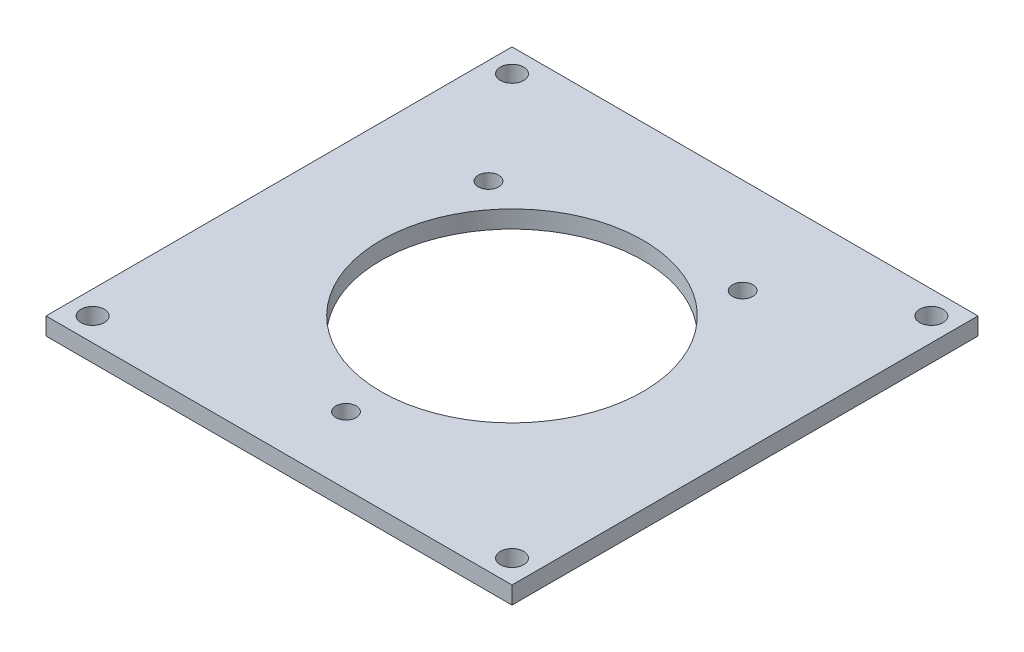
ISO-10303-21;
HEADER;
FILE_DESCRIPTION(('STEP AP214'),'2;1');
FILE_NAME('part.step','',(''),(''),'','','');
FILE_SCHEMA(('AUTOMOTIVE_DESIGN { 1 0 10303 214 1 1 1 1 }'));
ENDSEC;
DATA;
#1=APPLICATION_CONTEXT('core data for automotive mechanical design processes');
#2=APPLICATION_PROTOCOL_DEFINITION('international standard','automotive_design',2000,#1);
#3=PRODUCT_CONTEXT('',#1,'mechanical');
#4=PRODUCT('Part','Part','',(#3));
#5=PRODUCT_RELATED_PRODUCT_CATEGORY('part','',(#4));
#6=PRODUCT_DEFINITION_FORMATION('','',#4);
#7=PRODUCT_DEFINITION_CONTEXT('part definition',#1,'design');
#8=PRODUCT_DEFINITION('design','',#6,#7);
#9=PRODUCT_DEFINITION_SHAPE('','',#8);
#10=(LENGTH_UNIT() NAMED_UNIT(*) SI_UNIT(.MILLI.,.METRE.));
#11=(NAMED_UNIT(*) PLANE_ANGLE_UNIT() SI_UNIT($,.RADIAN.));
#12=(NAMED_UNIT(*) SI_UNIT($,.STERADIAN.) SOLID_ANGLE_UNIT());
#13=UNCERTAINTY_MEASURE_WITH_UNIT(LENGTH_MEASURE(1.E-05),#10,'distance_accuracy_value','');
#14=(GEOMETRIC_REPRESENTATION_CONTEXT(3) GLOBAL_UNCERTAINTY_ASSIGNED_CONTEXT((#13)) GLOBAL_UNIT_ASSIGNED_CONTEXT((#10,
#11,#12)) REPRESENTATION_CONTEXT('',''));
#15=CARTESIAN_POINT('',(0.,0.,0.));
#16=DIRECTION('',(0.,0.,1.));
#17=DIRECTION('',(1.,0.,0.));
#18=AXIS2_PLACEMENT_3D('',#15,#16,#17);
#19=CARTESIAN_POINT('',(-40.,3.,40.));
#20=DIRECTION('',(0.,1.,0.));
#21=DIRECTION('',(0.,0.,1.));
#22=AXIS2_PLACEMENT_3D('',#19,#20,#21);
#23=PLANE('',#22);
#24=CARTESIAN_POINT('',(36.,3.,36.));
#25=DIRECTION('',(0.,1.,0.));
#26=DIRECTION('',(0.,0.,1.));
#27=AXIS2_PLACEMENT_3D('',#24,#25,#26);
#28=CIRCLE('',#27,2.);
#29=CARTESIAN_POINT('',(36.,3.,38.));
#30=VERTEX_POINT('',#29);
#31=EDGE_CURVE('E144',#30,#30,#28,.T.);
#32=ORIENTED_EDGE('',*,*,#31,.F.);
#33=EDGE_LOOP('',(#32));
#34=FACE_BOUND('',#33,.T.);
#35=CARTESIAN_POINT('',(36.,3.,-36.));
#36=DIRECTION('',(0.,1.,0.));
#37=DIRECTION('',(0.,0.,-1.));
#38=AXIS2_PLACEMENT_3D('',#35,#36,#37);
#39=CIRCLE('',#38,2.);
#40=CARTESIAN_POINT('',(36.,3.,-38.));
#41=VERTEX_POINT('',#40);
#42=EDGE_CURVE('E132',#41,#41,#39,.T.);
#43=ORIENTED_EDGE('',*,*,#42,.F.);
#44=EDGE_LOOP('',(#43));
#45=FACE_BOUND('',#44,.T.);
#46=CARTESIAN_POINT('',(0.,3.,28.5));
#47=DIRECTION('',(0.,1.,0.));
#48=DIRECTION('',(0.,0.,1.));
#49=AXIS2_PLACEMENT_3D('',#46,#47,#48);
#50=CIRCLE('',#49,1.75);
#51=CARTESIAN_POINT('',(0.,3.,30.25));
#52=VERTEX_POINT('',#51);
#53=EDGE_CURVE('E120',#52,#52,#50,.T.);
#54=ORIENTED_EDGE('',*,*,#53,.F.);
#55=EDGE_LOOP('',(#54));
#56=FACE_BOUND('',#55,.T.);
#57=CARTESIAN_POINT('',(-36.,3.,-36.));
#58=DIRECTION('',(0.,1.,0.));
#59=DIRECTION('',(0.,0.,1.));
#60=AXIS2_PLACEMENT_3D('',#57,#58,#59);
#61=CIRCLE('',#60,2.);
#62=CARTESIAN_POINT('',(-36.,3.,-34.));
#63=VERTEX_POINT('',#62);
#64=EDGE_CURVE('E99',#63,#63,#61,.T.);
#65=ORIENTED_EDGE('',*,*,#64,.F.);
#66=EDGE_LOOP('',(#65));
#67=FACE_BOUND('',#66,.T.);
#68=DIRECTION('',(0.,0.,1.));
#69=VECTOR('',#68,1.);
#70=CARTESIAN_POINT('',(-40.,3.,-40.));
#71=LINE('',#70,#69);
#72=CARTESIAN_POINT('',(-40.,3.,-40.));
#73=VERTEX_POINT('',#72);
#74=CARTESIAN_POINT('',(-40.,3.,40.));
#75=VERTEX_POINT('',#74);
#76=EDGE_CURVE('E84',#73,#75,#71,.T.);
#77=ORIENTED_EDGE('',*,*,#76,.T.);
#78=DIRECTION('',(1.,0.,0.));
#79=VECTOR('',#78,1.);
#80=CARTESIAN_POINT('',(-40.,3.,40.));
#81=LINE('',#80,#79);
#82=CARTESIAN_POINT('',(40.,3.,40.));
#83=VERTEX_POINT('',#82);
#84=EDGE_CURVE('E79',#75,#83,#81,.T.);
#85=ORIENTED_EDGE('',*,*,#84,.T.);
#86=DIRECTION('',(0.,0.,-1.));
#87=VECTOR('',#86,1.);
#88=CARTESIAN_POINT('',(40.,3.,-40.));
#89=LINE('',#88,#87);
#90=CARTESIAN_POINT('',(40.,3.,-40.));
#91=VERTEX_POINT('',#90);
#92=EDGE_CURVE('E82',#83,#91,#89,.T.);
#93=ORIENTED_EDGE('',*,*,#92,.T.);
#94=DIRECTION('',(-1.,0.,0.));
#95=VECTOR('',#94,1.);
#96=CARTESIAN_POINT('',(-40.,3.,-40.));
#97=LINE('',#96,#95);
#98=EDGE_CURVE('E49',#91,#73,#97,.T.);
#99=ORIENTED_EDGE('',*,*,#98,.T.);
#100=EDGE_LOOP('',(#77,#85,#93,#99));
#101=FACE_BOUND('',#100,.T.);
#102=CARTESIAN_POINT('',(-22.0713342198514,3.,-18.030701754386));
#103=DIRECTION('',(0.,1.,0.));
#104=DIRECTION('',(0.,0.,1.));
#105=AXIS2_PLACEMENT_3D('',#102,#103,#104);
#106=CIRCLE('',#105,1.75);
#107=CARTESIAN_POINT('',(-22.0713342198514,3.,-16.280701754386));
#108=VERTEX_POINT('',#107);
#109=EDGE_CURVE('E114',#108,#108,#106,.T.);
#110=ORIENTED_EDGE('',*,*,#109,.F.);
#111=EDGE_LOOP('',(#110));
#112=FACE_BOUND('',#111,.T.);
#113=CARTESIAN_POINT('',(16.0287564116208,3.,-23.5654188992457));
#114=DIRECTION('',(0.,1.,0.));
#115=DIRECTION('',(0.,0.,1.));
#116=AXIS2_PLACEMENT_3D('',#113,#114,#115);
#117=CIRCLE('',#116,1.75);
#118=CARTESIAN_POINT('',(16.0287564116208,3.,-21.8154188992457));
#119=VERTEX_POINT('',#118);
#120=EDGE_CURVE('E126',#119,#119,#117,.T.);
#121=ORIENTED_EDGE('',*,*,#120,.F.);
#122=EDGE_LOOP('',(#121));
#123=FACE_BOUND('',#122,.T.);
#124=CARTESIAN_POINT('',(-36.,3.,36.));
#125=DIRECTION('',(0.,1.,0.));
#126=DIRECTION('',(0.,0.,-1.));
#127=AXIS2_PLACEMENT_3D('',#124,#125,#126);
#128=CIRCLE('',#127,2.);
#129=CARTESIAN_POINT('',(-36.,3.,34.));
#130=VERTEX_POINT('',#129);
#131=EDGE_CURVE('E138',#130,#130,#128,.T.);
#132=ORIENTED_EDGE('',*,*,#131,.F.);
#133=EDGE_LOOP('',(#132));
#134=FACE_BOUND('',#133,.T.);
#135=CARTESIAN_POINT('',(0.,3.,0.));
#136=DIRECTION('',(0.,1.,0.));
#137=DIRECTION('',(0.,0.,1.));
#138=AXIS2_PLACEMENT_3D('',#135,#136,#137);
#139=CIRCLE('',#138,22.5);
#140=CARTESIAN_POINT('',(0.,3.,22.5));
#141=VERTEX_POINT('',#140);
#142=EDGE_CURVE('E150',#141,#141,#139,.T.);
#143=ORIENTED_EDGE('',*,*,#142,.F.);
#144=EDGE_LOOP('',(#143));
#145=FACE_BOUND('',#144,.T.);
#146=ADVANCED_FACE('F32',(#34,#45,#56,#67,#101,#112,#123,#134,#145),#23,.T.);
#147=CARTESIAN_POINT('',(-40.,0.,40.));
#148=DIRECTION('',(0.,1.,0.));
#149=DIRECTION('',(0.,0.,1.));
#150=AXIS2_PLACEMENT_3D('',#147,#148,#149);
#151=PLANE('',#150);
#152=CARTESIAN_POINT('',(36.,0.,36.));
#153=DIRECTION('',(0.,1.,0.));
#154=DIRECTION('',(0.,0.,1.));
#155=AXIS2_PLACEMENT_3D('',#152,#153,#154);
#156=CIRCLE('',#155,2.);
#157=CARTESIAN_POINT('',(36.,0.,38.));
#158=VERTEX_POINT('',#157);
#159=EDGE_CURVE('E147',#158,#158,#156,.T.);
#160=ORIENTED_EDGE('',*,*,#159,.T.);
#161=EDGE_LOOP('',(#160));
#162=FACE_BOUND('',#161,.T.);
#163=CARTESIAN_POINT('',(36.,0.,-36.));
#164=DIRECTION('',(0.,1.,0.));
#165=DIRECTION('',(0.,0.,-1.));
#166=AXIS2_PLACEMENT_3D('',#163,#164,#165);
#167=CIRCLE('',#166,2.);
#168=CARTESIAN_POINT('',(36.,0.,-38.));
#169=VERTEX_POINT('',#168);
#170=EDGE_CURVE('E135',#169,#169,#167,.T.);
#171=ORIENTED_EDGE('',*,*,#170,.T.);
#172=EDGE_LOOP('',(#171));
#173=FACE_BOUND('',#172,.T.);
#174=CARTESIAN_POINT('',(0.,0.,28.5));
#175=DIRECTION('',(0.,1.,0.));
#176=DIRECTION('',(0.,0.,1.));
#177=AXIS2_PLACEMENT_3D('',#174,#175,#176);
#178=CIRCLE('',#177,1.75);
#179=CARTESIAN_POINT('',(0.,0.,30.25));
#180=VERTEX_POINT('',#179);
#181=EDGE_CURVE('E123',#180,#180,#178,.T.);
#182=ORIENTED_EDGE('',*,*,#181,.T.);
#183=EDGE_LOOP('',(#182));
#184=FACE_BOUND('',#183,.T.);
#185=CARTESIAN_POINT('',(-36.,0.,-36.));
#186=DIRECTION('',(0.,1.,0.));
#187=DIRECTION('',(0.,0.,1.));
#188=AXIS2_PLACEMENT_3D('',#185,#186,#187);
#189=CIRCLE('',#188,2.);
#190=CARTESIAN_POINT('',(-36.,0.,-34.));
#191=VERTEX_POINT('',#190);
#192=EDGE_CURVE('E111',#191,#191,#189,.T.);
#193=ORIENTED_EDGE('',*,*,#192,.T.);
#194=EDGE_LOOP('',(#193));
#195=FACE_BOUND('',#194,.T.);
#196=DIRECTION('',(0.,0.,1.));
#197=VECTOR('',#196,1.);
#198=CARTESIAN_POINT('',(-40.,0.,-40.));
#199=LINE('',#198,#197);
#200=CARTESIAN_POINT('',(-40.,0.,-40.));
#201=VERTEX_POINT('',#200);
#202=CARTESIAN_POINT('',(-40.,0.,40.));
#203=VERTEX_POINT('',#202);
#204=EDGE_CURVE('E96',#201,#203,#199,.T.);
#205=ORIENTED_EDGE('',*,*,#204,.F.);
#206=DIRECTION('',(-1.,0.,0.));
#207=VECTOR('',#206,1.);
#208=CARTESIAN_POINT('',(-40.,0.,-40.));
#209=LINE('',#208,#207);
#210=CARTESIAN_POINT('',(40.,0.,-40.));
#211=VERTEX_POINT('',#210);
#212=EDGE_CURVE('E72',#211,#201,#209,.T.);
#213=ORIENTED_EDGE('',*,*,#212,.F.);
#214=DIRECTION('',(0.,0.,-1.));
#215=VECTOR('',#214,1.);
#216=CARTESIAN_POINT('',(40.,0.,-40.));
#217=LINE('',#216,#215);
#218=CARTESIAN_POINT('',(40.,0.,40.));
#219=VERTEX_POINT('',#218);
#220=EDGE_CURVE('E66',#219,#211,#217,.T.);
#221=ORIENTED_EDGE('',*,*,#220,.F.);
#222=DIRECTION('',(1.,0.,0.));
#223=VECTOR('',#222,1.);
#224=CARTESIAN_POINT('',(-40.,0.,40.));
#225=LINE('',#224,#223);
#226=EDGE_CURVE('E88',#203,#219,#225,.T.);
#227=ORIENTED_EDGE('',*,*,#226,.F.);
#228=EDGE_LOOP('',(#205,#213,#221,#227));
#229=FACE_BOUND('',#228,.T.);
#230=CARTESIAN_POINT('',(-22.0713342198514,0.,-18.030701754386));
#231=DIRECTION('',(0.,1.,0.));
#232=DIRECTION('',(0.,0.,1.));
#233=AXIS2_PLACEMENT_3D('',#230,#231,#232);
#234=CIRCLE('',#233,1.75);
#235=CARTESIAN_POINT('',(-22.0713342198514,0.,-16.280701754386));
#236=VERTEX_POINT('',#235);
#237=EDGE_CURVE('E117',#236,#236,#234,.T.);
#238=ORIENTED_EDGE('',*,*,#237,.T.);
#239=EDGE_LOOP('',(#238));
#240=FACE_BOUND('',#239,.T.);
#241=CARTESIAN_POINT('',(16.0287564116208,0.,-23.5654188992457));
#242=DIRECTION('',(0.,1.,0.));
#243=DIRECTION('',(0.,0.,1.));
#244=AXIS2_PLACEMENT_3D('',#241,#242,#243);
#245=CIRCLE('',#244,1.75);
#246=CARTESIAN_POINT('',(16.0287564116208,0.,-21.8154188992457));
#247=VERTEX_POINT('',#246);
#248=EDGE_CURVE('E129',#247,#247,#245,.T.);
#249=ORIENTED_EDGE('',*,*,#248,.T.);
#250=EDGE_LOOP('',(#249));
#251=FACE_BOUND('',#250,.T.);
#252=CARTESIAN_POINT('',(-36.,0.,36.));
#253=DIRECTION('',(0.,1.,0.));
#254=DIRECTION('',(0.,0.,-1.));
#255=AXIS2_PLACEMENT_3D('',#252,#253,#254);
#256=CIRCLE('',#255,2.);
#257=CARTESIAN_POINT('',(-36.,0.,34.));
#258=VERTEX_POINT('',#257);
#259=EDGE_CURVE('E141',#258,#258,#256,.T.);
#260=ORIENTED_EDGE('',*,*,#259,.T.);
#261=EDGE_LOOP('',(#260));
#262=FACE_BOUND('',#261,.T.);
#263=CARTESIAN_POINT('',(0.,0.,0.));
#264=DIRECTION('',(0.,1.,0.));
#265=DIRECTION('',(0.,0.,1.));
#266=AXIS2_PLACEMENT_3D('',#263,#264,#265);
#267=CIRCLE('',#266,22.5);
#268=CARTESIAN_POINT('',(0.,0.,22.5));
#269=VERTEX_POINT('',#268);
#270=EDGE_CURVE('E153',#269,#269,#267,.T.);
#271=ORIENTED_EDGE('',*,*,#270,.T.);
#272=EDGE_LOOP('',(#271));
#273=FACE_BOUND('',#272,.T.);
#274=ADVANCED_FACE('F107',(#162,#173,#184,#195,#229,#240,#251,#262,#273),#151,.F.);
#275=CARTESIAN_POINT('',(-40.,3.,-40.));
#276=DIRECTION('',(1.,0.,0.));
#277=DIRECTION('',(0.,0.,-1.));
#278=AXIS2_PLACEMENT_3D('',#275,#276,#277);
#279=PLANE('',#278);
#280=ORIENTED_EDGE('',*,*,#204,.T.);
#281=DIRECTION('',(0.,-1.,0.));
#282=VECTOR('',#281,1.);
#283=CARTESIAN_POINT('',(-40.,3.,40.));
#284=LINE('',#283,#282);
#285=EDGE_CURVE('E11',#75,#203,#284,.T.);
#286=ORIENTED_EDGE('',*,*,#285,.F.);
#287=ORIENTED_EDGE('',*,*,#76,.F.);
#288=DIRECTION('',(0.,-1.,0.));
#289=VECTOR('',#288,1.);
#290=CARTESIAN_POINT('',(-40.,3.,-40.));
#291=LINE('',#290,#289);
#292=EDGE_CURVE('E92',#73,#201,#291,.T.);
#293=ORIENTED_EDGE('',*,*,#292,.T.);
#294=EDGE_LOOP('',(#280,#286,#287,#293));
#295=FACE_BOUND('',#294,.T.);
#296=ADVANCED_FACE('F34',(#295),#279,.F.);
#297=CARTESIAN_POINT('',(-40.,3.,40.));
#298=DIRECTION('',(0.,0.,-1.));
#299=DIRECTION('',(-1.,0.,0.));
#300=AXIS2_PLACEMENT_3D('',#297,#298,#299);
#301=PLANE('',#300);
#302=ORIENTED_EDGE('',*,*,#226,.T.);
#303=DIRECTION('',(0.,-1.,0.));
#304=VECTOR('',#303,1.);
#305=CARTESIAN_POINT('',(40.,3.,40.));
#306=LINE('',#305,#304);
#307=EDGE_CURVE('E41',#83,#219,#306,.T.);
#308=ORIENTED_EDGE('',*,*,#307,.F.);
#309=ORIENTED_EDGE('',*,*,#84,.F.);
#310=ORIENTED_EDGE('',*,*,#285,.T.);
#311=EDGE_LOOP('',(#302,#308,#309,#310));
#312=FACE_BOUND('',#311,.T.);
#313=ADVANCED_FACE('F87',(#312),#301,.F.);
#314=CARTESIAN_POINT('',(40.,3.,-40.));
#315=DIRECTION('',(-1.,0.,0.));
#316=DIRECTION('',(0.,0.,1.));
#317=AXIS2_PLACEMENT_3D('',#314,#315,#316);
#318=PLANE('',#317);
#319=ORIENTED_EDGE('',*,*,#220,.T.);
#320=DIRECTION('',(0.,-1.,0.));
#321=VECTOR('',#320,1.);
#322=CARTESIAN_POINT('',(40.,3.,-40.));
#323=LINE('',#322,#321);
#324=EDGE_CURVE('E89',#91,#211,#323,.T.);
#325=ORIENTED_EDGE('',*,*,#324,.F.);
#326=ORIENTED_EDGE('',*,*,#92,.F.);
#327=ORIENTED_EDGE('',*,*,#307,.T.);
#328=EDGE_LOOP('',(#319,#325,#326,#327));
#329=FACE_BOUND('',#328,.T.);
#330=ADVANCED_FACE('F90',(#329),#318,.F.);
#331=CARTESIAN_POINT('',(-40.,3.,-40.));
#332=DIRECTION('',(0.,0.,1.));
#333=DIRECTION('',(1.,0.,0.));
#334=AXIS2_PLACEMENT_3D('',#331,#332,#333);
#335=PLANE('',#334);
#336=ORIENTED_EDGE('',*,*,#212,.T.);
#337=ORIENTED_EDGE('',*,*,#292,.F.);
#338=ORIENTED_EDGE('',*,*,#98,.F.);
#339=ORIENTED_EDGE('',*,*,#324,.T.);
#340=EDGE_LOOP('',(#336,#337,#338,#339));
#341=FACE_BOUND('',#340,.T.);
#342=ADVANCED_FACE('F104',(#341),#335,.F.);
#343=CARTESIAN_POINT('',(-36.,3.,-36.));
#344=DIRECTION('',(0.,-1.,0.));
#345=DIRECTION('',(0.,0.,-1.));
#346=AXIS2_PLACEMENT_3D('',#343,#344,#345);
#347=CYLINDRICAL_SURFACE('',#346,2.);
#348=ORIENTED_EDGE('',*,*,#64,.T.);
#349=EDGE_LOOP('',(#348));
#350=FACE_BOUND('',#349,.T.);
#351=ORIENTED_EDGE('',*,*,#192,.F.);
#352=EDGE_LOOP('',(#351));
#353=FACE_BOUND('',#352,.T.);
#354=ADVANCED_FACE('F173',(#350,#353),#347,.F.);
#355=CARTESIAN_POINT('',(-22.0713342198514,3.,-18.030701754386));
#356=DIRECTION('',(0.,-1.,0.));
#357=DIRECTION('',(0.,0.,-1.));
#358=AXIS2_PLACEMENT_3D('',#355,#356,#357);
#359=CYLINDRICAL_SURFACE('',#358,1.75);
#360=ORIENTED_EDGE('',*,*,#109,.T.);
#361=EDGE_LOOP('',(#360));
#362=FACE_BOUND('',#361,.T.);
#363=ORIENTED_EDGE('',*,*,#237,.F.);
#364=EDGE_LOOP('',(#363));
#365=FACE_BOUND('',#364,.T.);
#366=ADVANCED_FACE('F219',(#362,#365),#359,.F.);
#367=CARTESIAN_POINT('',(0.,3.,28.5));
#368=DIRECTION('',(0.,-1.,0.));
#369=DIRECTION('',(0.,0.,-1.));
#370=AXIS2_PLACEMENT_3D('',#367,#368,#369);
#371=CYLINDRICAL_SURFACE('',#370,1.75);
#372=ORIENTED_EDGE('',*,*,#53,.T.);
#373=EDGE_LOOP('',(#372));
#374=FACE_BOUND('',#373,.T.);
#375=ORIENTED_EDGE('',*,*,#181,.F.);
#376=EDGE_LOOP('',(#375));
#377=FACE_BOUND('',#376,.T.);
#378=ADVANCED_FACE('F227',(#374,#377),#371,.F.);
#379=CARTESIAN_POINT('',(16.0287564116208,3.,-23.5654188992457));
#380=DIRECTION('',(0.,-1.,0.));
#381=DIRECTION('',(0.,0.,-1.));
#382=AXIS2_PLACEMENT_3D('',#379,#380,#381);
#383=CYLINDRICAL_SURFACE('',#382,1.75);
#384=ORIENTED_EDGE('',*,*,#120,.T.);
#385=EDGE_LOOP('',(#384));
#386=FACE_BOUND('',#385,.T.);
#387=ORIENTED_EDGE('',*,*,#248,.F.);
#388=EDGE_LOOP('',(#387));
#389=FACE_BOUND('',#388,.T.);
#390=ADVANCED_FACE('F235',(#386,#389),#383,.F.);
#391=CARTESIAN_POINT('',(36.,3.,-36.));
#392=DIRECTION('',(0.,-1.,0.));
#393=DIRECTION('',(0.,0.,-1.));
#394=AXIS2_PLACEMENT_3D('',#391,#392,#393);
#395=CYLINDRICAL_SURFACE('',#394,2.);
#396=ORIENTED_EDGE('',*,*,#42,.T.);
#397=EDGE_LOOP('',(#396));
#398=FACE_BOUND('',#397,.T.);
#399=ORIENTED_EDGE('',*,*,#170,.F.);
#400=EDGE_LOOP('',(#399));
#401=FACE_BOUND('',#400,.T.);
#402=ADVANCED_FACE('F244',(#398,#401),#395,.F.);
#403=CARTESIAN_POINT('',(-36.,3.,36.));
#404=DIRECTION('',(0.,-1.,0.));
#405=DIRECTION('',(0.,0.,-1.));
#406=AXIS2_PLACEMENT_3D('',#403,#404,#405);
#407=CYLINDRICAL_SURFACE('',#406,2.);
#408=ORIENTED_EDGE('',*,*,#131,.T.);
#409=EDGE_LOOP('',(#408));
#410=FACE_BOUND('',#409,.T.);
#411=ORIENTED_EDGE('',*,*,#259,.F.);
#412=EDGE_LOOP('',(#411));
#413=FACE_BOUND('',#412,.T.);
#414=ADVANCED_FACE('F253',(#410,#413),#407,.F.);
#415=CARTESIAN_POINT('',(36.,3.,36.));
#416=DIRECTION('',(0.,-1.,0.));
#417=DIRECTION('',(0.,0.,-1.));
#418=AXIS2_PLACEMENT_3D('',#415,#416,#417);
#419=CYLINDRICAL_SURFACE('',#418,2.);
#420=ORIENTED_EDGE('',*,*,#31,.T.);
#421=EDGE_LOOP('',(#420));
#422=FACE_BOUND('',#421,.T.);
#423=ORIENTED_EDGE('',*,*,#159,.F.);
#424=EDGE_LOOP('',(#423));
#425=FACE_BOUND('',#424,.T.);
#426=ADVANCED_FACE('F262',(#422,#425),#419,.F.);
#427=CARTESIAN_POINT('',(0.,3.,0.));
#428=DIRECTION('',(0.,-1.,0.));
#429=DIRECTION('',(0.,0.,-1.));
#430=AXIS2_PLACEMENT_3D('',#427,#428,#429);
#431=CYLINDRICAL_SURFACE('',#430,22.5);
#432=ORIENTED_EDGE('',*,*,#142,.T.);
#433=EDGE_LOOP('',(#432));
#434=FACE_BOUND('',#433,.T.);
#435=ORIENTED_EDGE('',*,*,#270,.F.);
#436=EDGE_LOOP('',(#435));
#437=FACE_BOUND('',#436,.T.);
#438=ADVANCED_FACE('F159',(#434,#437),#431,.F.);
#439=CLOSED_SHELL('',(#146,#274,#296,#313,#330,#342,#354,#366,#378,#390,#402,#414,#426,#438));
#440=MANIFOLD_SOLID_BREP('B2',#439);
#441=ADVANCED_BREP_SHAPE_REPRESENTATION('',(#18,#440),#14);
#442=SHAPE_DEFINITION_REPRESENTATION(#9,#441);
ENDSEC;
END-ISO-10303-21;
